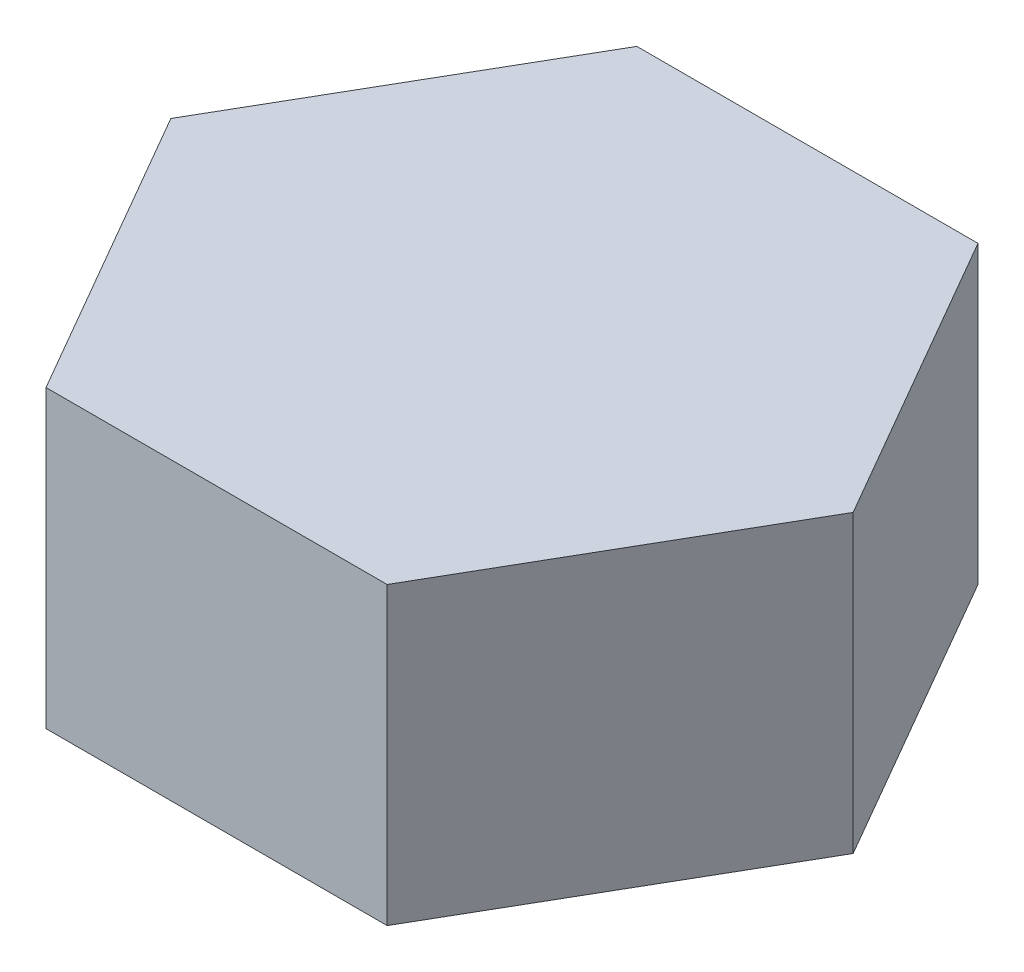
ISO-10303-21;
HEADER;
FILE_DESCRIPTION(('STEP AP214'),'2;1');
FILE_NAME('part.step','',(''),(''),'','','');
FILE_SCHEMA(('AUTOMOTIVE_DESIGN { 1 0 10303 214 1 1 1 1 }'));
ENDSEC;
DATA;
#1=APPLICATION_CONTEXT('core data for automotive mechanical design processes');
#2=APPLICATION_PROTOCOL_DEFINITION('international standard','automotive_design',2000,#1);
#3=PRODUCT_CONTEXT('',#1,'mechanical');
#4=PRODUCT('Part','Part','',(#3));
#5=PRODUCT_RELATED_PRODUCT_CATEGORY('part','',(#4));
#6=PRODUCT_DEFINITION_FORMATION('','',#4);
#7=PRODUCT_DEFINITION_CONTEXT('part definition',#1,'design');
#8=PRODUCT_DEFINITION('design','',#6,#7);
#9=PRODUCT_DEFINITION_SHAPE('','',#8);
#10=(LENGTH_UNIT() NAMED_UNIT(*) SI_UNIT(.MILLI.,.METRE.));
#11=(NAMED_UNIT(*) PLANE_ANGLE_UNIT() SI_UNIT($,.RADIAN.));
#12=(NAMED_UNIT(*) SI_UNIT($,.STERADIAN.) SOLID_ANGLE_UNIT());
#13=UNCERTAINTY_MEASURE_WITH_UNIT(LENGTH_MEASURE(1.E-05),#10,'distance_accuracy_value','');
#14=(GEOMETRIC_REPRESENTATION_CONTEXT(3) GLOBAL_UNCERTAINTY_ASSIGNED_CONTEXT((#13)) GLOBAL_UNIT_ASSIGNED_CONTEXT((#10,
#11,#12)) REPRESENTATION_CONTEXT('',''));
#15=CARTESIAN_POINT('',(0.,0.,0.));
#16=DIRECTION('',(0.,0.,1.));
#17=DIRECTION('',(1.,0.,0.));
#18=AXIS2_PLACEMENT_3D('',#15,#16,#17);
#19=CARTESIAN_POINT('',(86.6025403784438,150.,-150.));
#20=DIRECTION('',(0.,0.,1.));
#21=DIRECTION('',(1.,0.,0.));
#22=AXIS2_PLACEMENT_3D('',#19,#20,#21);
#23=PLANE('',#22);
#24=DIRECTION('',(-1.,0.,0.));
#25=VECTOR('',#24,1.);
#26=CARTESIAN_POINT('',(86.6025403784438,0.,-150.));
#27=LINE('',#26,#25);
#28=CARTESIAN_POINT('',(86.6025403784438,0.,-150.));
#29=VERTEX_POINT('',#28);
#30=CARTESIAN_POINT('',(-86.6025403784439,0.,-150.));
#31=VERTEX_POINT('',#30);
#32=EDGE_CURVE('E121',#29,#31,#27,.T.);
#33=ORIENTED_EDGE('',*,*,#32,.T.);
#34=DIRECTION('',(0.,-1.,0.));
#35=VECTOR('',#34,1.);
#36=CARTESIAN_POINT('',(-86.6025403784439,150.,-150.));
#37=LINE('',#36,#35);
#38=CARTESIAN_POINT('',(-86.6025403784439,150.,-150.));
#39=VERTEX_POINT('',#38);
#40=EDGE_CURVE('E11',#39,#31,#37,.T.);
#41=ORIENTED_EDGE('',*,*,#40,.F.);
#42=DIRECTION('',(-1.,0.,0.));
#43=VECTOR('',#42,1.);
#44=CARTESIAN_POINT('',(86.6025403784438,150.,-150.));
#45=LINE('',#44,#43);
#46=CARTESIAN_POINT('',(86.6025403784438,150.,-150.));
#47=VERTEX_POINT('',#46);
#48=EDGE_CURVE('E131',#47,#39,#45,.T.);
#49=ORIENTED_EDGE('',*,*,#48,.F.);
#50=DIRECTION('',(0.,-1.,0.));
#51=VECTOR('',#50,1.);
#52=CARTESIAN_POINT('',(86.6025403784438,150.,-150.));
#53=LINE('',#52,#51);
#54=EDGE_CURVE('E117',#47,#29,#53,.T.);
#55=ORIENTED_EDGE('',*,*,#54,.T.);
#56=EDGE_LOOP('',(#33,#41,#49,#55));
#57=FACE_BOUND('',#56,.T.);
#58=ADVANCED_FACE('F37',(#57),#23,.F.);
#59=CARTESIAN_POINT('',(-86.6025403784439,150.,-150.));
#60=DIRECTION('',(0.866025403784438,0.,0.5));
#61=DIRECTION('',(0.5,0.,-0.866025403784439));
#62=AXIS2_PLACEMENT_3D('',#59,#60,#61);
#63=PLANE('',#62);
#64=DIRECTION('',(-0.5,0.,0.866025403784438));
#65=VECTOR('',#64,1.);
#66=CARTESIAN_POINT('',(-86.6025403784439,0.,-150.));
#67=LINE('',#66,#65);
#68=CARTESIAN_POINT('',(-173.205080756888,0.,0.));
#69=VERTEX_POINT('',#68);
#70=EDGE_CURVE('E124',#31,#69,#67,.T.);
#71=ORIENTED_EDGE('',*,*,#70,.T.);
#72=DIRECTION('',(0.,-1.,0.));
#73=VECTOR('',#72,1.);
#74=CARTESIAN_POINT('',(-173.205080756888,150.,0.));
#75=LINE('',#74,#73);
#76=CARTESIAN_POINT('',(-173.205080756888,150.,0.));
#77=VERTEX_POINT('',#76);
#78=EDGE_CURVE('E45',#77,#69,#75,.T.);
#79=ORIENTED_EDGE('',*,*,#78,.F.);
#80=DIRECTION('',(-0.5,0.,0.866025403784438));
#81=VECTOR('',#80,1.);
#82=CARTESIAN_POINT('',(-86.6025403784439,150.,-150.));
#83=LINE('',#82,#81);
#84=EDGE_CURVE('E90',#39,#77,#83,.T.);
#85=ORIENTED_EDGE('',*,*,#84,.F.);
#86=ORIENTED_EDGE('',*,*,#40,.T.);
#87=EDGE_LOOP('',(#71,#79,#85,#86));
#88=FACE_BOUND('',#87,.T.);
#89=ADVANCED_FACE('F155',(#88),#63,.F.);
#90=CARTESIAN_POINT('',(-173.205080756888,150.,0.));
#91=DIRECTION('',(0.866025403784439,0.,-0.5));
#92=DIRECTION('',(-0.5,0.,-0.866025403784439));
#93=AXIS2_PLACEMENT_3D('',#90,#91,#92);
#94=PLANE('',#93);
#95=DIRECTION('',(0.5,0.,0.866025403784439));
#96=VECTOR('',#95,1.);
#97=CARTESIAN_POINT('',(-173.205080756888,0.,0.));
#98=LINE('',#97,#96);
#99=CARTESIAN_POINT('',(-86.6025403784439,0.,150.));
#100=VERTEX_POINT('',#99);
#101=EDGE_CURVE('E126',#69,#100,#98,.T.);
#102=ORIENTED_EDGE('',*,*,#101,.T.);
#103=DIRECTION('',(0.,-1.,0.));
#104=VECTOR('',#103,1.);
#105=CARTESIAN_POINT('',(-86.6025403784439,150.,150.));
#106=LINE('',#105,#104);
#107=CARTESIAN_POINT('',(-86.6025403784439,150.,150.));
#108=VERTEX_POINT('',#107);
#109=EDGE_CURVE('E112',#108,#100,#106,.T.);
#110=ORIENTED_EDGE('',*,*,#109,.F.);
#111=DIRECTION('',(0.5,0.,0.866025403784439));
#112=VECTOR('',#111,1.);
#113=CARTESIAN_POINT('',(-173.205080756888,150.,0.));
#114=LINE('',#113,#112);
#115=EDGE_CURVE('E103',#77,#108,#114,.T.);
#116=ORIENTED_EDGE('',*,*,#115,.F.);
#117=ORIENTED_EDGE('',*,*,#78,.T.);
#118=EDGE_LOOP('',(#102,#110,#116,#117));
#119=FACE_BOUND('',#118,.T.);
#120=ADVANCED_FACE('F137',(#119),#94,.F.);
#121=CARTESIAN_POINT('',(-86.6025403784439,150.,150.));
#122=DIRECTION('',(0.,0.,-1.));
#123=DIRECTION('',(-1.,0.,0.));
#124=AXIS2_PLACEMENT_3D('',#121,#122,#123);
#125=PLANE('',#124);
#126=DIRECTION('',(1.,0.,0.));
#127=VECTOR('',#126,1.);
#128=CARTESIAN_POINT('',(-86.6025403784439,0.,150.));
#129=LINE('',#128,#127);
#130=CARTESIAN_POINT('',(86.6025403784438,0.,150.));
#131=VERTEX_POINT('',#130);
#132=EDGE_CURVE('E111',#100,#131,#129,.T.);
#133=ORIENTED_EDGE('',*,*,#132,.T.);
#134=DIRECTION('',(0.,-1.,0.));
#135=VECTOR('',#134,1.);
#136=CARTESIAN_POINT('',(86.6025403784438,150.,150.));
#137=LINE('',#136,#135);
#138=CARTESIAN_POINT('',(86.6025403784438,150.,150.));
#139=VERTEX_POINT('',#138);
#140=EDGE_CURVE('E108',#139,#131,#137,.T.);
#141=ORIENTED_EDGE('',*,*,#140,.F.);
#142=DIRECTION('',(1.,0.,0.));
#143=VECTOR('',#142,1.);
#144=CARTESIAN_POINT('',(-86.6025403784439,150.,150.));
#145=LINE('',#144,#143);
#146=EDGE_CURVE('E97',#108,#139,#145,.T.);
#147=ORIENTED_EDGE('',*,*,#146,.F.);
#148=ORIENTED_EDGE('',*,*,#109,.T.);
#149=EDGE_LOOP('',(#133,#141,#147,#148));
#150=FACE_BOUND('',#149,.T.);
#151=ADVANCED_FACE('F109',(#150),#125,.F.);
#152=CARTESIAN_POINT('',(86.6025403784438,150.,150.));
#153=DIRECTION('',(-0.866025403784439,0.,-0.5));
#154=DIRECTION('',(-0.5,0.,0.866025403784439));
#155=AXIS2_PLACEMENT_3D('',#152,#153,#154);
#156=PLANE('',#155);
#157=DIRECTION('',(0.5,0.,-0.866025403784439));
#158=VECTOR('',#157,1.);
#159=CARTESIAN_POINT('',(86.6025403784438,0.,150.));
#160=LINE('',#159,#158);
#161=CARTESIAN_POINT('',(173.205080756888,0.,0.));
#162=VERTEX_POINT('',#161);
#163=EDGE_CURVE('E76',#131,#162,#160,.T.);
#164=ORIENTED_EDGE('',*,*,#163,.T.);
#165=DIRECTION('',(0.,-1.,0.));
#166=VECTOR('',#165,1.);
#167=CARTESIAN_POINT('',(173.205080756888,150.,0.));
#168=LINE('',#167,#166);
#169=CARTESIAN_POINT('',(173.205080756888,150.,0.));
#170=VERTEX_POINT('',#169);
#171=EDGE_CURVE('E113',#170,#162,#168,.T.);
#172=ORIENTED_EDGE('',*,*,#171,.F.);
#173=DIRECTION('',(0.5,0.,-0.866025403784439));
#174=VECTOR('',#173,1.);
#175=CARTESIAN_POINT('',(86.6025403784438,150.,150.));
#176=LINE('',#175,#174);
#177=EDGE_CURVE('E101',#139,#170,#176,.T.);
#178=ORIENTED_EDGE('',*,*,#177,.F.);
#179=ORIENTED_EDGE('',*,*,#140,.T.);
#180=EDGE_LOOP('',(#164,#172,#178,#179));
#181=FACE_BOUND('',#180,.T.);
#182=ADVANCED_FACE('F115',(#181),#156,.F.);
#183=CARTESIAN_POINT('',(173.205080756888,150.,0.));
#184=DIRECTION('',(-0.866025403784438,0.,0.5));
#185=DIRECTION('',(0.5,0.,0.866025403784439));
#186=AXIS2_PLACEMENT_3D('',#183,#184,#185);
#187=PLANE('',#186);
#188=DIRECTION('',(-0.5,0.,-0.866025403784438));
#189=VECTOR('',#188,1.);
#190=CARTESIAN_POINT('',(173.205080756888,0.,0.));
#191=LINE('',#190,#189);
#192=EDGE_CURVE('E82',#162,#29,#191,.T.);
#193=ORIENTED_EDGE('',*,*,#192,.T.);
#194=ORIENTED_EDGE('',*,*,#54,.F.);
#195=DIRECTION('',(-0.5,0.,-0.866025403784438));
#196=VECTOR('',#195,1.);
#197=CARTESIAN_POINT('',(173.205080756888,150.,0.));
#198=LINE('',#197,#196);
#199=EDGE_CURVE('E53',#170,#47,#198,.T.);
#200=ORIENTED_EDGE('',*,*,#199,.F.);
#201=ORIENTED_EDGE('',*,*,#171,.T.);
#202=EDGE_LOOP('',(#193,#194,#200,#201));
#203=FACE_BOUND('',#202,.T.);
#204=ADVANCED_FACE('F144',(#203),#187,.F.);
#205=CARTESIAN_POINT('',(0.,150.,0.));
#206=DIRECTION('',(0.,1.,0.));
#207=DIRECTION('',(0.,0.,1.));
#208=AXIS2_PLACEMENT_3D('',#205,#206,#207);
#209=PLANE('',#208);
#210=ORIENTED_EDGE('',*,*,#48,.T.);
#211=ORIENTED_EDGE('',*,*,#84,.T.);
#212=ORIENTED_EDGE('',*,*,#115,.T.);
#213=ORIENTED_EDGE('',*,*,#146,.T.);
#214=ORIENTED_EDGE('',*,*,#177,.T.);
#215=ORIENTED_EDGE('',*,*,#199,.T.);
#216=EDGE_LOOP('',(#210,#211,#212,#213,#214,#215));
#217=FACE_BOUND('',#216,.T.);
#218=ADVANCED_FACE('F99',(#217),#209,.T.);
#219=CARTESIAN_POINT('',(0.,0.,0.));
#220=DIRECTION('',(0.,1.,0.));
#221=DIRECTION('',(0.,0.,1.));
#222=AXIS2_PLACEMENT_3D('',#219,#220,#221);
#223=PLANE('',#222);
#224=ORIENTED_EDGE('',*,*,#32,.F.);
#225=ORIENTED_EDGE('',*,*,#192,.F.);
#226=ORIENTED_EDGE('',*,*,#163,.F.);
#227=ORIENTED_EDGE('',*,*,#132,.F.);
#228=ORIENTED_EDGE('',*,*,#101,.F.);
#229=ORIENTED_EDGE('',*,*,#70,.F.);
#230=EDGE_LOOP('',(#224,#225,#226,#227,#228,#229));
#231=FACE_BOUND('',#230,.T.);
#232=ADVANCED_FACE('F140',(#231),#223,.F.);
#233=CLOSED_SHELL('',(#58,#89,#120,#151,#182,#204,#218,#232));
#234=MANIFOLD_SOLID_BREP('B2',#233);
#235=ADVANCED_BREP_SHAPE_REPRESENTATION('',(#18,#234),#14);
#236=SHAPE_DEFINITION_REPRESENTATION(#9,#235);
ENDSEC;
END-ISO-10303-21;
